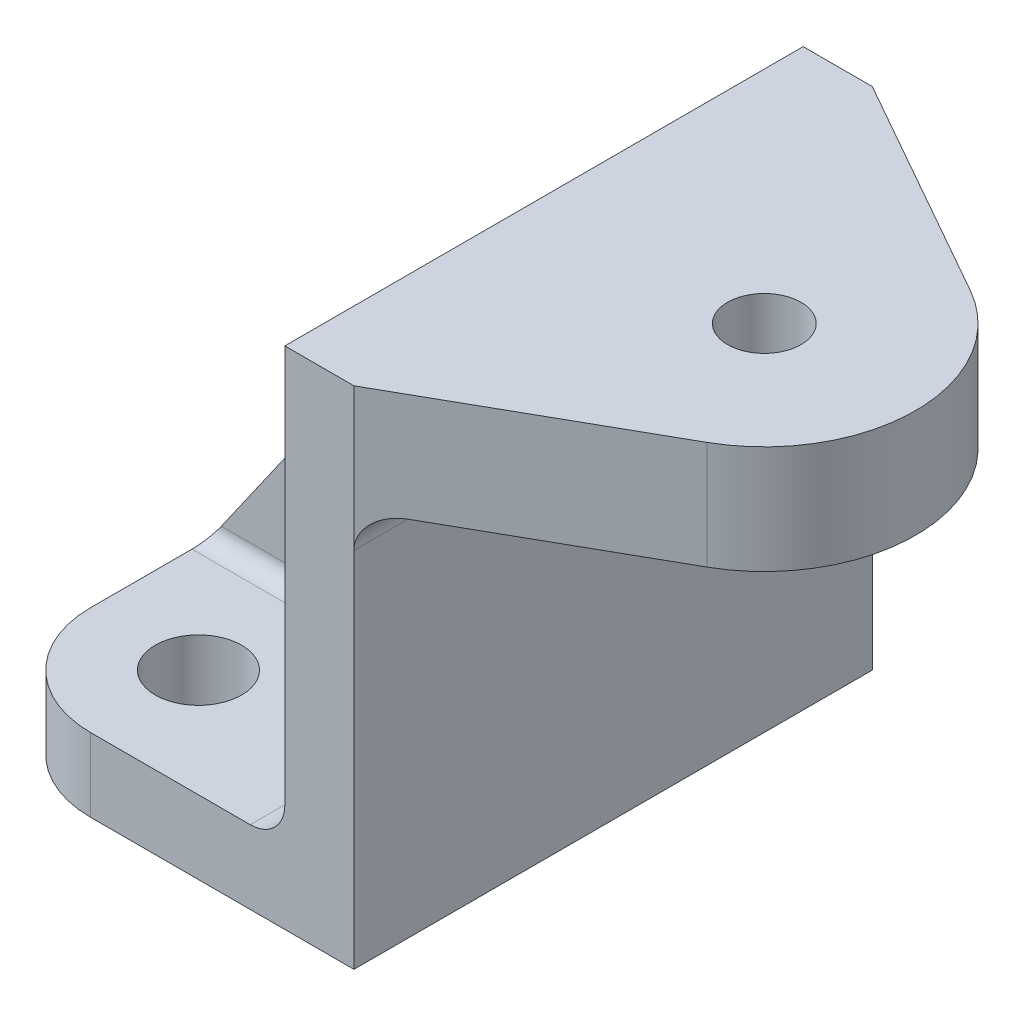
ISO-10303-21;
HEADER;
FILE_DESCRIPTION(('STEP AP214'),'2;1');
FILE_NAME('part.step','',(''),(''),'','','');
FILE_SCHEMA(('AUTOMOTIVE_DESIGN { 1 0 10303 214 1 1 1 1 }'));
ENDSEC;
DATA;
#1=APPLICATION_CONTEXT('core data for automotive mechanical design processes');
#2=APPLICATION_PROTOCOL_DEFINITION('international standard','automotive_design',2000,#1);
#3=PRODUCT_CONTEXT('',#1,'mechanical');
#4=PRODUCT('Part','Part','',(#3));
#5=PRODUCT_RELATED_PRODUCT_CATEGORY('part','',(#4));
#6=PRODUCT_DEFINITION_FORMATION('','',#4);
#7=PRODUCT_DEFINITION_CONTEXT('part definition',#1,'design');
#8=PRODUCT_DEFINITION('design','',#6,#7);
#9=PRODUCT_DEFINITION_SHAPE('','',#8);
#10=(LENGTH_UNIT() NAMED_UNIT(*) SI_UNIT(.MILLI.,.METRE.));
#11=(NAMED_UNIT(*) PLANE_ANGLE_UNIT() SI_UNIT($,.RADIAN.));
#12=(NAMED_UNIT(*) SI_UNIT($,.STERADIAN.) SOLID_ANGLE_UNIT());
#13=UNCERTAINTY_MEASURE_WITH_UNIT(LENGTH_MEASURE(1.E-05),#10,'distance_accuracy_value','');
#14=(GEOMETRIC_REPRESENTATION_CONTEXT(3) GLOBAL_UNCERTAINTY_ASSIGNED_CONTEXT((#13)) GLOBAL_UNIT_ASSIGNED_CONTEXT((#10,
#11,#12)) REPRESENTATION_CONTEXT('',''));
#15=CARTESIAN_POINT('',(0.,0.,0.));
#16=DIRECTION('',(0.,0.,1.));
#17=DIRECTION('',(1.,0.,0.));
#18=AXIS2_PLACEMENT_3D('',#15,#16,#17);
#19=CARTESIAN_POINT('',(-30.5000000000001,17.,35.));
#20=DIRECTION('',(0.,-1.,0.));
#21=DIRECTION('',(0.,0.,-1.));
#22=AXIS2_PLACEMENT_3D('',#19,#20,#21);
#23=PLANE('',#22);
#24=CARTESIAN_POINT('',(-30.5000000000001,17.,-35.));
#25=DIRECTION('',(0.,1.,0.));
#26=DIRECTION('',(0.,0.,1.));
#27=AXIS2_PLACEMENT_3D('',#24,#25,#26);
#28=CIRCLE('',#27,10.);
#29=CARTESIAN_POINT('',(-30.5000000000001,17.,-25.));
#30=VERTEX_POINT('',#29);
#31=EDGE_CURVE('E236',#30,#30,#28,.T.);
#32=ORIENTED_EDGE('',*,*,#31,.F.);
#33=EDGE_LOOP('',(#32));
#34=FACE_BOUND('',#33,.T.);
#35=DIRECTION('',(0.,0.,1.));
#36=VECTOR('',#35,1.);
#37=CARTESIAN_POINT('',(-55.5000000000001,17.,-35.));
#38=LINE('',#37,#36);
#39=CARTESIAN_POINT('',(-55.5000000000001,17.,-35.));
#40=VERTEX_POINT('',#39);
#41=CARTESIAN_POINT('',(-55.5000000000001,17.,-11.5));
#42=VERTEX_POINT('',#41);
#43=EDGE_CURVE('E248',#40,#42,#38,.T.);
#44=ORIENTED_EDGE('',*,*,#43,.T.);
#45=DIRECTION('',(-1.,0.,0.));
#46=VECTOR('',#45,1.);
#47=CARTESIAN_POINT('',(6.49999999999992,17.,-11.5));
#48=LINE('',#47,#46);
#49=CARTESIAN_POINT('',(6.49999999999991,17.,-11.5));
#50=VERTEX_POINT('',#49);
#51=EDGE_CURVE('E303',#42,#50,#48,.F.);
#52=ORIENTED_EDGE('',*,*,#51,.T.);
#53=DIRECTION('',(0.,0.,1.));
#54=VECTOR('',#53,1.);
#55=CARTESIAN_POINT('',(6.49999999999991,17.,-60.));
#56=LINE('',#55,#54);
#57=CARTESIAN_POINT('',(6.49999999999991,17.,-60.));
#58=VERTEX_POINT('',#57);
#59=EDGE_CURVE('E288',#50,#58,#56,.F.);
#60=ORIENTED_EDGE('',*,*,#59,.T.);
#61=DIRECTION('',(-1.,0.,0.));
#62=VECTOR('',#61,1.);
#63=CARTESIAN_POINT('',(-30.4999999999999,17.,-60.));
#64=LINE('',#63,#62);
#65=CARTESIAN_POINT('',(-30.4999999999999,17.,-60.));
#66=VERTEX_POINT('',#65);
#67=EDGE_CURVE('E242',#58,#66,#64,.T.);
#68=ORIENTED_EDGE('',*,*,#67,.T.);
#69=CARTESIAN_POINT('',(-30.5000000000001,17.,-35.));
#70=DIRECTION('',(0.,1.,0.));
#71=DIRECTION('',(0.,0.,1.));
#72=AXIS2_PLACEMENT_3D('',#69,#70,#71);
#73=CIRCLE('',#72,25.);
#74=EDGE_CURVE('E244',#66,#40,#73,.T.);
#75=ORIENTED_EDGE('',*,*,#74,.T.);
#76=EDGE_LOOP('',(#44,#52,#60,#68,#75));
#77=FACE_BOUND('',#76,.T.);
#78=ADVANCED_FACE('F35',(#34,#77),#23,.F.);
#79=CARTESIAN_POINT('',(14.4999999999999,117.,-60.));
#80=DIRECTION('',(1.,0.,0.));
#81=DIRECTION('',(0.,0.,-1.));
#82=AXIS2_PLACEMENT_3D('',#79,#80,#81);
#83=PLANE('',#82);
#84=DIRECTION('',(0.,0.,1.));
#85=VECTOR('',#84,1.);
#86=CARTESIAN_POINT('',(14.4999999999999,25.,60.));
#87=LINE('',#86,#85);
#88=CARTESIAN_POINT('',(14.4999999999999,25.,-60.));
#89=VERTEX_POINT('',#88);
#90=CARTESIAN_POINT('',(14.4999999999999,25.,-11.5));
#91=VERTEX_POINT('',#90);
#92=EDGE_CURVE('E285',#89,#91,#87,.T.);
#93=ORIENTED_EDGE('',*,*,#92,.T.);
#94=DIRECTION('',(0.,-1.,0.));
#95=VECTOR('',#94,1.);
#96=CARTESIAN_POINT('',(14.4999999999999,117.,-11.5));
#97=LINE('',#96,#95);
#98=CARTESIAN_POINT('',(14.4999999999999,117.,-11.5));
#99=VERTEX_POINT('',#98);
#100=EDGE_CURVE('E318',#91,#99,#97,.F.);
#101=ORIENTED_EDGE('',*,*,#100,.T.);
#102=DIRECTION('',(0.,0.,1.));
#103=VECTOR('',#102,1.);
#104=CARTESIAN_POINT('',(14.4999999999999,117.,-60.));
#105=LINE('',#104,#103);
#106=CARTESIAN_POINT('',(14.4999999999999,117.,-60.));
#107=VERTEX_POINT('',#106);
#108=EDGE_CURVE('E218',#107,#99,#105,.T.);
#109=ORIENTED_EDGE('',*,*,#108,.F.);
#110=DIRECTION('',(0.,-1.,0.));
#111=VECTOR('',#110,1.);
#112=CARTESIAN_POINT('',(14.4999999999999,117.,-60.));
#113=LINE('',#112,#111);
#114=EDGE_CURVE('E226',#107,#89,#113,.T.);
#115=ORIENTED_EDGE('',*,*,#114,.T.);
#116=EDGE_LOOP('',(#93,#101,#109,#115));
#117=FACE_BOUND('',#116,.T.);
#118=ADVANCED_FACE('F387',(#117),#83,.F.);
#119=CARTESIAN_POINT('',(6.49999999999991,25.,-60.));
#120=DIRECTION('',(0.,0.,-1.));
#121=DIRECTION('',(-1.,0.,0.));
#122=AXIS2_PLACEMENT_3D('',#119,#120,#121);
#123=CYLINDRICAL_SURFACE('',#122,8.);
#124=ORIENTED_EDGE('',*,*,#59,.F.);
#125=CARTESIAN_POINT('',(6.49999999999991,25.,-11.5));
#126=DIRECTION('',(0.,0.,1.));
#127=DIRECTION('',(1.,0.,0.));
#128=AXIS2_PLACEMENT_3D('',#125,#126,#127);
#129=CIRCLE('',#128,8.);
#130=EDGE_CURVE('E305',#50,#91,#129,.T.);
#131=ORIENTED_EDGE('',*,*,#130,.T.);
#132=ORIENTED_EDGE('',*,*,#92,.F.);
#133=CARTESIAN_POINT('',(6.49999999999991,25.,-60.));
#134=DIRECTION('',(0.,0.,1.));
#135=DIRECTION('',(1.,0.,0.));
#136=AXIS2_PLACEMENT_3D('',#133,#134,#135);
#137=CIRCLE('',#136,8.);
#138=EDGE_CURVE('E294',#58,#89,#137,.T.);
#139=ORIENTED_EDGE('',*,*,#138,.F.);
#140=EDGE_LOOP('',(#124,#131,#132,#139));
#141=FACE_BOUND('',#140,.T.);
#142=ADVANCED_FACE('F383',(#141),#123,.F.);
#143=CARTESIAN_POINT('',(-30.5000000000001,17.,35.));
#144=DIRECTION('',(0.,1.,0.));
#145=DIRECTION('',(0.,0.,1.));
#146=AXIS2_PLACEMENT_3D('',#143,#144,#145);
#147=CIRCLE('',#146,10.);
#148=CARTESIAN_POINT('',(-30.5000000000001,17.,45.));
#149=VERTEX_POINT('',#148);
#150=EDGE_CURVE('E230',#149,#149,#147,.T.);
#151=ORIENTED_EDGE('',*,*,#150,.F.);
#152=EDGE_LOOP('',(#151));
#153=FACE_BOUND('',#152,.T.);
#154=CARTESIAN_POINT('',(6.49999999999992,17.,60.));
#155=VERTEX_POINT('',#154);
#156=CARTESIAN_POINT('',(6.49999999999992,17.,11.5));
#157=VERTEX_POINT('',#156);
#158=EDGE_CURVE('E289',#155,#157,#56,.F.);
#159=ORIENTED_EDGE('',*,*,#158,.T.);
#160=DIRECTION('',(-1.,0.,0.));
#161=VECTOR('',#160,1.);
#162=CARTESIAN_POINT('',(-30.5000000000001,17.,11.5));
#163=LINE('',#162,#161);
#164=CARTESIAN_POINT('',(-55.5000000000001,17.,11.5));
#165=VERTEX_POINT('',#164);
#166=EDGE_CURVE('E307',#157,#165,#163,.T.);
#167=ORIENTED_EDGE('',*,*,#166,.T.);
#168=CARTESIAN_POINT('',(-55.5000000000001,17.,35.));
#169=VERTEX_POINT('',#168);
#170=EDGE_CURVE('E247',#165,#169,#38,.T.);
#171=ORIENTED_EDGE('',*,*,#170,.T.);
#172=CARTESIAN_POINT('',(-30.5000000000001,17.,35.));
#173=DIRECTION('',(0.,1.,0.));
#174=DIRECTION('',(0.,0.,-1.));
#175=AXIS2_PLACEMENT_3D('',#172,#173,#174);
#176=CIRCLE('',#175,25.);
#177=CARTESIAN_POINT('',(-30.4999999999999,17.,60.));
#178=VERTEX_POINT('',#177);
#179=EDGE_CURVE('E251',#169,#178,#176,.T.);
#180=ORIENTED_EDGE('',*,*,#179,.T.);
#181=DIRECTION('',(1.,0.,0.));
#182=VECTOR('',#181,1.);
#183=CARTESIAN_POINT('',(-30.4999999999999,17.,60.));
#184=LINE('',#183,#182);
#185=EDGE_CURVE('E253',#178,#155,#184,.T.);
#186=ORIENTED_EDGE('',*,*,#185,.T.);
#187=EDGE_LOOP('',(#159,#167,#171,#180,#186));
#188=FACE_BOUND('',#187,.T.);
#189=ADVANCED_FACE('F437',(#153,#188),#23,.F.);
#190=CARTESIAN_POINT('',(-30.5000000000001,0.,35.));
#191=DIRECTION('',(0.,-1.,0.));
#192=DIRECTION('',(0.,0.,-1.));
#193=AXIS2_PLACEMENT_3D('',#190,#191,#192);
#194=PLANE('',#193);
#195=CARTESIAN_POINT('',(-30.5000000000001,0.,35.));
#196=DIRECTION('',(0.,1.,0.));
#197=DIRECTION('',(0.,0.,-1.));
#198=AXIS2_PLACEMENT_3D('',#195,#196,#197);
#199=CIRCLE('',#198,25.);
#200=CARTESIAN_POINT('',(-55.5000000000001,0.,35.));
#201=VERTEX_POINT('',#200);
#202=CARTESIAN_POINT('',(-30.4999999999999,0.,60.));
#203=VERTEX_POINT('',#202);
#204=EDGE_CURVE('E265',#201,#203,#199,.T.);
#205=ORIENTED_EDGE('',*,*,#204,.F.);
#206=DIRECTION('',(0.,0.,1.));
#207=VECTOR('',#206,1.);
#208=CARTESIAN_POINT('',(-55.5000000000001,0.,-35.));
#209=LINE('',#208,#207);
#210=CARTESIAN_POINT('',(-55.5000000000001,0.,-35.));
#211=VERTEX_POINT('',#210);
#212=EDGE_CURVE('E263',#211,#201,#209,.T.);
#213=ORIENTED_EDGE('',*,*,#212,.F.);
#214=CARTESIAN_POINT('',(-30.5000000000001,0.,-35.));
#215=DIRECTION('',(0.,1.,0.));
#216=DIRECTION('',(0.,0.,1.));
#217=AXIS2_PLACEMENT_3D('',#214,#215,#216);
#218=CIRCLE('',#217,25.);
#219=CARTESIAN_POINT('',(-30.4999999999999,0.,-60.));
#220=VERTEX_POINT('',#219);
#221=EDGE_CURVE('E261',#220,#211,#218,.T.);
#222=ORIENTED_EDGE('',*,*,#221,.F.);
#223=DIRECTION('',(-1.,0.,0.));
#224=VECTOR('',#223,1.);
#225=CARTESIAN_POINT('',(-30.4999999999999,0.,-60.));
#226=LINE('',#225,#224);
#227=CARTESIAN_POINT('',(30.4999999999999,0.,-60.));
#228=VERTEX_POINT('',#227);
#229=EDGE_CURVE('E259',#228,#220,#226,.T.);
#230=ORIENTED_EDGE('',*,*,#229,.F.);
#231=DIRECTION('',(0.,0.,-1.));
#232=VECTOR('',#231,1.);
#233=CARTESIAN_POINT('',(30.4999999999999,0.,-60.));
#234=LINE('',#233,#232);
#235=CARTESIAN_POINT('',(30.4999999999999,0.,60.));
#236=VERTEX_POINT('',#235);
#237=EDGE_CURVE('E239',#236,#228,#234,.T.);
#238=ORIENTED_EDGE('',*,*,#237,.F.);
#239=DIRECTION('',(1.,0.,0.));
#240=VECTOR('',#239,1.);
#241=CARTESIAN_POINT('',(-30.4999999999999,0.,60.));
#242=LINE('',#241,#240);
#243=EDGE_CURVE('E245',#203,#236,#242,.T.);
#244=ORIENTED_EDGE('',*,*,#243,.F.);
#245=EDGE_LOOP('',(#205,#213,#222,#230,#238,#244));
#246=FACE_BOUND('',#245,.T.);
#247=CARTESIAN_POINT('',(-30.5000000000001,0.,35.));
#248=DIRECTION('',(0.,1.,0.));
#249=DIRECTION('',(0.,0.,1.));
#250=AXIS2_PLACEMENT_3D('',#247,#248,#249);
#251=CIRCLE('',#250,10.);
#252=CARTESIAN_POINT('',(-30.5000000000001,0.,45.));
#253=VERTEX_POINT('',#252);
#254=EDGE_CURVE('E229',#253,#253,#251,.T.);
#255=ORIENTED_EDGE('',*,*,#254,.T.);
#256=EDGE_LOOP('',(#255));
#257=FACE_BOUND('',#256,.T.);
#258=CARTESIAN_POINT('',(-30.5000000000001,0.,-35.));
#259=DIRECTION('',(0.,1.,0.));
#260=DIRECTION('',(0.,0.,1.));
#261=AXIS2_PLACEMENT_3D('',#258,#259,#260);
#262=CIRCLE('',#261,10.);
#263=CARTESIAN_POINT('',(-30.5000000000001,0.,-25.));
#264=VERTEX_POINT('',#263);
#265=EDGE_CURVE('E233',#264,#264,#262,.T.);
#266=ORIENTED_EDGE('',*,*,#265,.T.);
#267=EDGE_LOOP('',(#266));
#268=FACE_BOUND('',#267,.T.);
#269=ADVANCED_FACE('F365',(#246,#257,#268),#194,.T.);
#270=CARTESIAN_POINT('',(30.4999999999999,17.,-60.));
#271=DIRECTION('',(-1.,0.,0.));
#272=DIRECTION('',(0.,0.,1.));
#273=AXIS2_PLACEMENT_3D('',#270,#271,#272);
#274=PLANE('',#273);
#275=DIRECTION('',(0.,-1.,0.));
#276=VECTOR('',#275,1.);
#277=CARTESIAN_POINT('',(30.4999999999999,17.,-60.));
#278=LINE('',#277,#276);
#279=CARTESIAN_POINT('',(30.4999999999999,84.,-60.));
#280=VERTEX_POINT('',#279);
#281=EDGE_CURVE('E282',#280,#228,#278,.T.);
#282=ORIENTED_EDGE('',*,*,#281,.F.);
#283=DIRECTION('',(0.,0.,1.));
#284=VECTOR('',#283,1.);
#285=CARTESIAN_POINT('',(30.4999999999999,84.,60.));
#286=LINE('',#285,#284);
#287=CARTESIAN_POINT('',(30.4999999999999,84.,60.));
#288=VERTEX_POINT('',#287);
#289=EDGE_CURVE('E333',#280,#288,#286,.T.);
#290=ORIENTED_EDGE('',*,*,#289,.T.);
#291=DIRECTION('',(0.,-1.,0.));
#292=VECTOR('',#291,1.);
#293=CARTESIAN_POINT('',(30.4999999999999,17.,60.));
#294=LINE('',#293,#292);
#295=EDGE_CURVE('E256',#288,#236,#294,.T.);
#296=ORIENTED_EDGE('',*,*,#295,.T.);
#297=ORIENTED_EDGE('',*,*,#237,.T.);
#298=EDGE_LOOP('',(#282,#290,#296,#297));
#299=FACE_BOUND('',#298,.T.);
#300=ADVANCED_FACE('F352',(#299),#274,.F.);
#301=CARTESIAN_POINT('',(-30.4999999999999,17.,-60.));
#302=DIRECTION('',(0.,0.,1.));
#303=DIRECTION('',(1.,0.,0.));
#304=AXIS2_PLACEMENT_3D('',#301,#302,#303);
#305=PLANE('',#304);
#306=ORIENTED_EDGE('',*,*,#229,.T.);
#307=DIRECTION('',(0.,-1.,0.));
#308=VECTOR('',#307,1.);
#309=CARTESIAN_POINT('',(-30.4999999999999,17.,-60.));
#310=LINE('',#309,#308);
#311=EDGE_CURVE('E279',#66,#220,#310,.T.);
#312=ORIENTED_EDGE('',*,*,#311,.F.);
#313=ORIENTED_EDGE('',*,*,#67,.F.);
#314=ORIENTED_EDGE('',*,*,#138,.T.);
#315=ORIENTED_EDGE('',*,*,#114,.F.);
#316=DIRECTION('',(-1.,0.,0.));
#317=VECTOR('',#316,1.);
#318=CARTESIAN_POINT('',(30.4999999999999,117.,-60.));
#319=LINE('',#318,#317);
#320=CARTESIAN_POINT('',(30.4999999999999,117.,-60.));
#321=VERTEX_POINT('',#320);
#322=EDGE_CURVE('E214',#321,#107,#319,.T.);
#323=ORIENTED_EDGE('',*,*,#322,.F.);
#324=EDGE_CURVE('E50',#321,#280,#278,.T.);
#325=ORIENTED_EDGE('',*,*,#324,.T.);
#326=ORIENTED_EDGE('',*,*,#281,.T.);
#327=EDGE_LOOP('',(#306,#312,#313,#314,#315,#323,#325,#326));
#328=FACE_BOUND('',#327,.T.);
#329=ADVANCED_FACE('F370',(#328),#305,.F.);
#330=CARTESIAN_POINT('',(-30.5000000000001,17.,-35.));
#331=DIRECTION('',(0.,-1.,0.));
#332=DIRECTION('',(0.,0.,-1.));
#333=AXIS2_PLACEMENT_3D('',#330,#331,#332);
#334=CYLINDRICAL_SURFACE('',#333,25.);
#335=ORIENTED_EDGE('',*,*,#221,.T.);
#336=DIRECTION('',(0.,-1.,0.));
#337=VECTOR('',#336,1.);
#338=CARTESIAN_POINT('',(-55.5000000000001,17.,-35.));
#339=LINE('',#338,#337);
#340=EDGE_CURVE('E276',#40,#211,#339,.T.);
#341=ORIENTED_EDGE('',*,*,#340,.F.);
#342=ORIENTED_EDGE('',*,*,#74,.F.);
#343=ORIENTED_EDGE('',*,*,#311,.T.);
#344=EDGE_LOOP('',(#335,#341,#342,#343));
#345=FACE_BOUND('',#344,.T.);
#346=ADVANCED_FACE('F374',(#345),#334,.T.);
#347=CARTESIAN_POINT('',(-55.5000000000001,17.,-35.));
#348=DIRECTION('',(1.,0.,0.));
#349=DIRECTION('',(0.,0.,-1.));
#350=AXIS2_PLACEMENT_3D('',#347,#348,#349);
#351=PLANE('',#350);
#352=ORIENTED_EDGE('',*,*,#170,.F.);
#353=DIRECTION('',(0.,0.,1.));
#354=VECTOR('',#353,1.);
#355=CARTESIAN_POINT('',(-55.5000000000001,17.,-35.));
#356=LINE('',#355,#354);
#357=EDGE_CURVE('E407',#42,#165,#356,.T.);
#358=ORIENTED_EDGE('',*,*,#357,.F.);
#359=ORIENTED_EDGE('',*,*,#43,.F.);
#360=ORIENTED_EDGE('',*,*,#340,.T.);
#361=ORIENTED_EDGE('',*,*,#212,.T.);
#362=DIRECTION('',(0.,-1.,0.));
#363=VECTOR('',#362,1.);
#364=CARTESIAN_POINT('',(-55.5000000000001,17.,35.));
#365=LINE('',#364,#363);
#366=EDGE_CURVE('E273',#169,#201,#365,.T.);
#367=ORIENTED_EDGE('',*,*,#366,.F.);
#368=EDGE_LOOP('',(#352,#358,#359,#360,#361,#367));
#369=FACE_BOUND('',#368,.T.);
#370=ADVANCED_FACE('F636',(#369),#351,.F.);
#371=CARTESIAN_POINT('',(-30.5000000000001,17.,35.));
#372=DIRECTION('',(0.,-1.,0.));
#373=DIRECTION('',(0.,0.,-1.));
#374=AXIS2_PLACEMENT_3D('',#371,#372,#373);
#375=CYLINDRICAL_SURFACE('',#374,25.);
#376=ORIENTED_EDGE('',*,*,#204,.T.);
#377=DIRECTION('',(0.,-1.,0.));
#378=VECTOR('',#377,1.);
#379=CARTESIAN_POINT('',(-30.4999999999999,17.,60.));
#380=LINE('',#379,#378);
#381=EDGE_CURVE('E270',#178,#203,#380,.T.);
#382=ORIENTED_EDGE('',*,*,#381,.F.);
#383=ORIENTED_EDGE('',*,*,#179,.F.);
#384=ORIENTED_EDGE('',*,*,#366,.T.);
#385=EDGE_LOOP('',(#376,#382,#383,#384));
#386=FACE_BOUND('',#385,.T.);
#387=ADVANCED_FACE('F529',(#386),#375,.T.);
#388=CARTESIAN_POINT('',(-30.4999999999999,17.,60.));
#389=DIRECTION('',(0.,0.,-1.));
#390=DIRECTION('',(-1.,0.,0.));
#391=AXIS2_PLACEMENT_3D('',#388,#389,#390);
#392=PLANE('',#391);
#393=ORIENTED_EDGE('',*,*,#243,.T.);
#394=ORIENTED_EDGE('',*,*,#295,.F.);
#395=CARTESIAN_POINT('',(30.4999999999999,117.,60.));
#396=VERTEX_POINT('',#395);
#397=EDGE_CURVE('E70',#396,#288,#294,.T.);
#398=ORIENTED_EDGE('',*,*,#397,.F.);
#399=DIRECTION('',(1.,0.,0.));
#400=VECTOR('',#399,1.);
#401=CARTESIAN_POINT('',(30.4999999999999,117.,60.));
#402=LINE('',#401,#400);
#403=CARTESIAN_POINT('',(14.4999999999999,117.,60.));
#404=VERTEX_POINT('',#403);
#405=EDGE_CURVE('E220',#404,#396,#402,.T.);
#406=ORIENTED_EDGE('',*,*,#405,.F.);
#407=DIRECTION('',(0.,-1.,0.));
#408=VECTOR('',#407,1.);
#409=CARTESIAN_POINT('',(14.4999999999999,117.,60.));
#410=LINE('',#409,#408);
#411=CARTESIAN_POINT('',(14.4999999999999,25.,60.));
#412=VERTEX_POINT('',#411);
#413=EDGE_CURVE('E223',#404,#412,#410,.T.);
#414=ORIENTED_EDGE('',*,*,#413,.T.);
#415=CARTESIAN_POINT('',(6.49999999999992,25.,60.));
#416=DIRECTION('',(0.,0.,-1.));
#417=DIRECTION('',(-1.,0.,0.));
#418=AXIS2_PLACEMENT_3D('',#415,#416,#417);
#419=CIRCLE('',#418,8.);
#420=EDGE_CURVE('E292',#412,#155,#419,.T.);
#421=ORIENTED_EDGE('',*,*,#420,.T.);
#422=ORIENTED_EDGE('',*,*,#185,.F.);
#423=ORIENTED_EDGE('',*,*,#381,.T.);
#424=EDGE_LOOP('',(#393,#394,#398,#406,#414,#421,#422,#423));
#425=FACE_BOUND('',#424,.T.);
#426=ADVANCED_FACE('F356',(#425),#392,.F.);
#427=CARTESIAN_POINT('',(-30.5000000000001,17.,-35.));
#428=DIRECTION('',(0.,-1.,0.));
#429=DIRECTION('',(0.,0.,-1.));
#430=AXIS2_PLACEMENT_3D('',#427,#428,#429);
#431=CYLINDRICAL_SURFACE('',#430,10.);
#432=ORIENTED_EDGE('',*,*,#31,.T.);
#433=EDGE_LOOP('',(#432));
#434=FACE_BOUND('',#433,.T.);
#435=ORIENTED_EDGE('',*,*,#265,.F.);
#436=EDGE_LOOP('',(#435));
#437=FACE_BOUND('',#436,.T.);
#438=ADVANCED_FACE('F528',(#434,#437),#431,.F.);
#439=CARTESIAN_POINT('',(-30.5000000000001,17.,35.));
#440=DIRECTION('',(0.,-1.,0.));
#441=DIRECTION('',(0.,0.,-1.));
#442=AXIS2_PLACEMENT_3D('',#439,#440,#441);
#443=CYLINDRICAL_SURFACE('',#442,10.);
#444=ORIENTED_EDGE('',*,*,#150,.T.);
#445=EDGE_LOOP('',(#444));
#446=FACE_BOUND('',#445,.T.);
#447=ORIENTED_EDGE('',*,*,#254,.F.);
#448=EDGE_LOOP('',(#447));
#449=FACE_BOUND('',#448,.T.);
#450=ADVANCED_FACE('F652',(#446,#449),#443,.F.);
#451=CARTESIAN_POINT('',(14.4999999999999,117.,11.5));
#452=VERTEX_POINT('',#451);
#453=EDGE_CURVE('E217',#452,#404,#105,.T.);
#454=ORIENTED_EDGE('',*,*,#453,.F.);
#455=DIRECTION('',(0.,-1.,0.));
#456=VECTOR('',#455,1.);
#457=CARTESIAN_POINT('',(14.4999999999999,117.,11.5));
#458=LINE('',#457,#456);
#459=CARTESIAN_POINT('',(14.4999999999999,25.,11.5));
#460=VERTEX_POINT('',#459);
#461=EDGE_CURVE('E321',#452,#460,#458,.T.);
#462=ORIENTED_EDGE('',*,*,#461,.T.);
#463=EDGE_CURVE('E284',#460,#412,#87,.T.);
#464=ORIENTED_EDGE('',*,*,#463,.T.);
#465=ORIENTED_EDGE('',*,*,#413,.F.);
#466=EDGE_LOOP('',(#454,#462,#464,#465));
#467=FACE_BOUND('',#466,.T.);
#468=ADVANCED_FACE('F421',(#467),#83,.F.);
#469=CARTESIAN_POINT('',(0.,117.,0.));
#470=DIRECTION('',(0.,-1.,0.));
#471=DIRECTION('',(0.,0.,-1.));
#472=AXIS2_PLACEMENT_3D('',#469,#470,#471);
#473=PLANE('',#472);
#474=CARTESIAN_POINT('',(65.4999999999999,117.,0.));
#475=DIRECTION('',(0.,1.,0.));
#476=DIRECTION('',(0.,0.,1.));
#477=AXIS2_PLACEMENT_3D('',#474,#475,#476);
#478=CIRCLE('',#477,8.50000000000001);
#479=CARTESIAN_POINT('',(65.4999999999999,117.,8.50000000000001));
#480=VERTEX_POINT('',#479);
#481=EDGE_CURVE('E411',#480,#480,#478,.T.);
#482=ORIENTED_EDGE('',*,*,#481,.F.);
#483=EDGE_LOOP('',(#482));
#484=FACE_BOUND('',#483,.T.);
#485=CARTESIAN_POINT('',(65.4999999999999,117.,0.));
#486=DIRECTION('',(0.,1.,0.));
#487=DIRECTION('',(0.,0.,1.));
#488=AXIS2_PLACEMENT_3D('',#485,#486,#487);
#489=CIRCLE('',#488,35.);
#490=CARTESIAN_POINT('',(82.7279792746113,117.,30.4663212435233));
#491=VERTEX_POINT('',#490);
#492=CARTESIAN_POINT('',(82.7279792746113,117.,-30.4663212435233));
#493=VERTEX_POINT('',#492);
#494=EDGE_CURVE('E198',#491,#493,#489,.T.);
#495=ORIENTED_EDGE('',*,*,#494,.T.);
#496=DIRECTION('',(-0.870466321243523,0.,-0.492227979274611));
#497=VECTOR('',#496,1.);
#498=CARTESIAN_POINT('',(30.4999999999999,117.,-60.));
#499=LINE('',#498,#497);
#500=EDGE_CURVE('E192',#493,#321,#499,.T.);
#501=ORIENTED_EDGE('',*,*,#500,.T.);
#502=ORIENTED_EDGE('',*,*,#322,.T.);
#503=ORIENTED_EDGE('',*,*,#108,.T.);
#504=EDGE_CURVE('E78',#99,#452,#105,.T.);
#505=ORIENTED_EDGE('',*,*,#504,.T.);
#506=ORIENTED_EDGE('',*,*,#453,.T.);
#507=ORIENTED_EDGE('',*,*,#405,.T.);
#508=DIRECTION('',(0.870466321243523,0.,-0.492227979274611));
#509=VECTOR('',#508,1.);
#510=CARTESIAN_POINT('',(30.4999999999999,117.,60.));
#511=LINE('',#510,#509);
#512=EDGE_CURVE('E208',#396,#491,#511,.T.);
#513=ORIENTED_EDGE('',*,*,#512,.T.);
#514=EDGE_LOOP('',(#495,#501,#502,#503,#505,#506,#507,#513));
#515=FACE_BOUND('',#514,.T.);
#516=ADVANCED_FACE('F418',(#484,#515),#473,.F.);
#517=ORIENTED_EDGE('',*,*,#463,.F.);
#518=CARTESIAN_POINT('',(6.49999999999992,25.,11.5));
#519=DIRECTION('',(0.,0.,1.));
#520=DIRECTION('',(1.,0.,0.));
#521=AXIS2_PLACEMENT_3D('',#518,#519,#520);
#522=CIRCLE('',#521,8.);
#523=EDGE_CURVE('E316',#460,#157,#522,.F.);
#524=ORIENTED_EDGE('',*,*,#523,.T.);
#525=ORIENTED_EDGE('',*,*,#158,.F.);
#526=ORIENTED_EDGE('',*,*,#420,.F.);
#527=EDGE_LOOP('',(#517,#524,#525,#526));
#528=FACE_BOUND('',#527,.T.);
#529=ADVANCED_FACE('F420',(#528),#123,.F.);
#530=CARTESIAN_POINT('',(30.4999999999999,92.,-60.));
#531=DIRECTION('',(0.492227979274611,0.,-0.870466321243524));
#532=DIRECTION('',(-0.870466321243524,0.,-0.492227979274611));
#533=AXIS2_PLACEMENT_3D('',#530,#531,#532);
#534=PLANE('',#533);
#535=ORIENTED_EDGE('',*,*,#500,.F.);
#536=DIRECTION('',(0.,1.,0.));
#537=VECTOR('',#536,1.);
#538=CARTESIAN_POINT('',(82.7279792746113,92.,-30.4663212435233));
#539=LINE('',#538,#537);
#540=CARTESIAN_POINT('',(82.7279792746113,92.,-30.4663212435233));
#541=VERTEX_POINT('',#540);
#542=EDGE_CURVE('E200',#541,#493,#539,.T.);
#543=ORIENTED_EDGE('',*,*,#542,.F.);
#544=DIRECTION('',(-0.870466321243523,0.,-0.492227979274611));
#545=VECTOR('',#544,1.);
#546=CARTESIAN_POINT('',(30.4999999999999,92.,-60.));
#547=LINE('',#546,#545);
#548=CARTESIAN_POINT('',(38.4999999999999,92.,-55.4761904761905));
#549=VERTEX_POINT('',#548);
#550=EDGE_CURVE('E201',#541,#549,#547,.T.);
#551=ORIENTED_EDGE('',*,*,#550,.T.);
#552=CARTESIAN_POINT('',(38.4999999999999,84.,-55.4761904761905));
#553=DIRECTION('',(0.492227979274611,0.,-0.870466321243524));
#554=DIRECTION('',(-0.870466321243524,0.,-0.492227979274611));
#555=AXIS2_PLACEMENT_3D('',#552,#553,#554);
#556=ELLIPSE('',#555,9.19047619047619,8.);
#557=EDGE_CURVE('E11',#549,#280,#556,.F.);
#558=ORIENTED_EDGE('',*,*,#557,.T.);
#559=ORIENTED_EDGE('',*,*,#324,.F.);
#560=EDGE_LOOP('',(#535,#543,#551,#558,#559));
#561=FACE_BOUND('',#560,.T.);
#562=ADVANCED_FACE('F425',(#561),#534,.T.);
#563=CARTESIAN_POINT('',(65.4999999999999,92.,0.));
#564=DIRECTION('',(0.,1.,0.));
#565=DIRECTION('',(0.,0.,1.));
#566=AXIS2_PLACEMENT_3D('',#563,#564,#565);
#567=CYLINDRICAL_SURFACE('',#566,35.);
#568=CARTESIAN_POINT('',(65.4999999999999,92.,0.));
#569=DIRECTION('',(0.,1.,0.));
#570=DIRECTION('',(0.,0.,1.));
#571=AXIS2_PLACEMENT_3D('',#568,#569,#570);
#572=CIRCLE('',#571,35.);
#573=CARTESIAN_POINT('',(82.7279792746113,92.,30.4663212435233));
#574=VERTEX_POINT('',#573);
#575=EDGE_CURVE('E191',#574,#541,#572,.T.);
#576=ORIENTED_EDGE('',*,*,#575,.T.);
#577=ORIENTED_EDGE('',*,*,#542,.T.);
#578=ORIENTED_EDGE('',*,*,#494,.F.);
#579=DIRECTION('',(0.,1.,0.));
#580=VECTOR('',#579,1.);
#581=CARTESIAN_POINT('',(82.7279792746113,92.,30.4663212435233));
#582=LINE('',#581,#580);
#583=EDGE_CURVE('E188',#574,#491,#582,.T.);
#584=ORIENTED_EDGE('',*,*,#583,.F.);
#585=EDGE_LOOP('',(#576,#577,#578,#584));
#586=FACE_BOUND('',#585,.T.);
#587=ADVANCED_FACE('F195',(#586),#567,.T.);
#588=CARTESIAN_POINT('',(30.4999999999999,92.,60.));
#589=DIRECTION('',(0.492227979274611,0.,0.870466321243523));
#590=DIRECTION('',(0.870466321243524,0.,-0.492227979274611));
#591=AXIS2_PLACEMENT_3D('',#588,#589,#590);
#592=PLANE('',#591);
#593=ORIENTED_EDGE('',*,*,#512,.F.);
#594=ORIENTED_EDGE('',*,*,#397,.T.);
#595=CARTESIAN_POINT('',(38.4999999999999,84.,55.4761904761905));
#596=DIRECTION('',(0.492227979274611,0.,0.870466321243523));
#597=DIRECTION('',(0.870466321243524,0.,-0.492227979274611));
#598=AXIS2_PLACEMENT_3D('',#595,#596,#597);
#599=ELLIPSE('',#598,9.19047619047619,8.);
#600=CARTESIAN_POINT('',(38.4999999999999,92.,55.4761904761905));
#601=VERTEX_POINT('',#600);
#602=EDGE_CURVE('E43',#288,#601,#599,.F.);
#603=ORIENTED_EDGE('',*,*,#602,.T.);
#604=DIRECTION('',(0.870466321243523,0.,-0.492227979274611));
#605=VECTOR('',#604,1.);
#606=CARTESIAN_POINT('',(30.4999999999999,92.,60.));
#607=LINE('',#606,#605);
#608=EDGE_CURVE('E185',#601,#574,#607,.T.);
#609=ORIENTED_EDGE('',*,*,#608,.T.);
#610=ORIENTED_EDGE('',*,*,#583,.T.);
#611=EDGE_LOOP('',(#593,#594,#603,#609,#610));
#612=FACE_BOUND('',#611,.T.);
#613=ADVANCED_FACE('F187',(#612),#592,.T.);
#614=CARTESIAN_POINT('',(65.4999999999999,92.,0.));
#615=DIRECTION('',(0.,1.,0.));
#616=DIRECTION('',(0.,0.,1.));
#617=AXIS2_PLACEMENT_3D('',#614,#615,#616);
#618=PLANE('',#617);
#619=CARTESIAN_POINT('',(65.4999999999999,92.,0.));
#620=DIRECTION('',(0.,1.,0.));
#621=DIRECTION('',(0.,0.,1.));
#622=AXIS2_PLACEMENT_3D('',#619,#620,#621);
#623=CIRCLE('',#622,8.50000000000001);
#624=CARTESIAN_POINT('',(65.4999999999999,92.,8.50000000000001));
#625=VERTEX_POINT('',#624);
#626=EDGE_CURVE('E210',#625,#625,#623,.T.);
#627=ORIENTED_EDGE('',*,*,#626,.T.);
#628=EDGE_LOOP('',(#627));
#629=FACE_BOUND('',#628,.T.);
#630=ORIENTED_EDGE('',*,*,#608,.F.);
#631=DIRECTION('',(0.,0.,1.));
#632=VECTOR('',#631,1.);
#633=CARTESIAN_POINT('',(38.4999999999999,92.,-60.));
#634=LINE('',#633,#632);
#635=EDGE_CURVE('E59',#601,#549,#634,.F.);
#636=ORIENTED_EDGE('',*,*,#635,.T.);
#637=ORIENTED_EDGE('',*,*,#550,.F.);
#638=ORIENTED_EDGE('',*,*,#575,.F.);
#639=EDGE_LOOP('',(#630,#636,#637,#638));
#640=FACE_BOUND('',#639,.T.);
#641=ADVANCED_FACE('F203',(#629,#640),#618,.F.);
#642=CARTESIAN_POINT('',(65.4999999999999,92.,0.));
#643=DIRECTION('',(0.,1.,0.));
#644=DIRECTION('',(0.,0.,1.));
#645=AXIS2_PLACEMENT_3D('',#642,#643,#644);
#646=CYLINDRICAL_SURFACE('',#645,8.50000000000001);
#647=ORIENTED_EDGE('',*,*,#626,.F.);
#648=EDGE_LOOP('',(#647));
#649=FACE_BOUND('',#648,.T.);
#650=ORIENTED_EDGE('',*,*,#481,.T.);
#651=EDGE_LOOP('',(#650));
#652=FACE_BOUND('',#651,.T.);
#653=ADVANCED_FACE('F416',(#649,#652),#646,.F.);
#654=CARTESIAN_POINT('',(22.4999999999999,58.5,7.5));
#655=DIRECTION('',(0.,0.,1.));
#656=DIRECTION('',(1.,0.,0.));
#657=AXIS2_PLACEMENT_3D('',#654,#655,#656);
#658=PLANE('',#657);
#659=DIRECTION('',(-0.573462344363328,-0.81923192051904,0.));
#660=VECTOR('',#659,1.);
#661=CARTESIAN_POINT('',(14.4999999999999,117.,7.5));
#662=LINE('',#661,#660);
#663=CARTESIAN_POINT('',(10.4999999999999,111.285714285714,7.5));
#664=VERTEX_POINT('',#663);
#665=CARTESIAN_POINT('',(-52.7000000000001,21.,7.5));
#666=VERTEX_POINT('',#665);
#667=EDGE_CURVE('E404',#664,#666,#662,.T.);
#668=ORIENTED_EDGE('',*,*,#667,.T.);
#669=DIRECTION('',(-1.,0.,0.));
#670=VECTOR('',#669,1.);
#671=CARTESIAN_POINT('',(22.4999999999999,21.,7.5));
#672=LINE('',#671,#670);
#673=CARTESIAN_POINT('',(6.49999999999992,21.,7.5));
#674=VERTEX_POINT('',#673);
#675=EDGE_CURVE('E314',#666,#674,#672,.F.);
#676=ORIENTED_EDGE('',*,*,#675,.T.);
#677=CARTESIAN_POINT('',(6.49999999999992,25.,7.5));
#678=DIRECTION('',(0.,0.,1.));
#679=DIRECTION('',(1.,0.,0.));
#680=AXIS2_PLACEMENT_3D('',#677,#678,#679);
#681=CIRCLE('',#680,4.);
#682=CARTESIAN_POINT('',(10.4999999999999,25.,7.5));
#683=VERTEX_POINT('',#682);
#684=EDGE_CURVE('E312',#674,#683,#681,.T.);
#685=ORIENTED_EDGE('',*,*,#684,.T.);
#686=DIRECTION('',(0.,-1.,0.));
#687=VECTOR('',#686,1.);
#688=CARTESIAN_POINT('',(10.4999999999999,58.5,7.5));
#689=LINE('',#688,#687);
#690=EDGE_CURVE('E310',#683,#664,#689,.F.);
#691=ORIENTED_EDGE('',*,*,#690,.T.);
#692=EDGE_LOOP('',(#668,#676,#685,#691));
#693=FACE_BOUND('',#692,.T.);
#694=ADVANCED_FACE('F469',(#693),#658,.T.);
#695=CARTESIAN_POINT('',(22.4999999999999,58.5,-7.5));
#696=DIRECTION('',(0.,0.,1.));
#697=DIRECTION('',(1.,0.,0.));
#698=AXIS2_PLACEMENT_3D('',#695,#696,#697);
#699=PLANE('',#698);
#700=CARTESIAN_POINT('',(6.49999999999991,25.,-7.5));
#701=DIRECTION('',(0.,0.,1.));
#702=DIRECTION('',(1.,0.,0.));
#703=AXIS2_PLACEMENT_3D('',#700,#701,#702);
#704=CIRCLE('',#703,4.);
#705=CARTESIAN_POINT('',(10.4999999999999,25.,-7.5));
#706=VERTEX_POINT('',#705);
#707=CARTESIAN_POINT('',(6.49999999999991,21.,-7.5));
#708=VERTEX_POINT('',#707);
#709=EDGE_CURVE('E298',#706,#708,#704,.F.);
#710=ORIENTED_EDGE('',*,*,#709,.T.);
#711=DIRECTION('',(-1.,0.,0.));
#712=VECTOR('',#711,1.);
#713=CARTESIAN_POINT('',(-55.5000000000001,21.,-7.5));
#714=LINE('',#713,#712);
#715=CARTESIAN_POINT('',(-52.7000000000001,21.,-7.5));
#716=VERTEX_POINT('',#715);
#717=EDGE_CURVE('E300',#708,#716,#714,.T.);
#718=ORIENTED_EDGE('',*,*,#717,.T.);
#719=DIRECTION('',(-0.573462344363328,-0.81923192051904,0.));
#720=VECTOR('',#719,1.);
#721=CARTESIAN_POINT('',(14.4999999999999,117.,-7.5));
#722=LINE('',#721,#720);
#723=CARTESIAN_POINT('',(10.4999999999999,111.285714285714,-7.5));
#724=VERTEX_POINT('',#723);
#725=EDGE_CURVE('E341',#724,#716,#722,.T.);
#726=ORIENTED_EDGE('',*,*,#725,.F.);
#727=DIRECTION('',(0.,-1.,0.));
#728=VECTOR('',#727,1.);
#729=CARTESIAN_POINT('',(10.4999999999999,25.,-7.5));
#730=LINE('',#729,#728);
#731=EDGE_CURVE('E296',#724,#706,#730,.T.);
#732=ORIENTED_EDGE('',*,*,#731,.T.);
#733=EDGE_LOOP('',(#710,#718,#726,#732));
#734=FACE_BOUND('',#733,.T.);
#735=ADVANCED_FACE('F400',(#734),#699,.F.);
#736=CARTESIAN_POINT('',(14.4999999999999,117.,0.));
#737=DIRECTION('',(-0.81923192051904,0.573462344363328,0.));
#738=DIRECTION('',(-0.573462344363328,-0.81923192051904,0.));
#739=AXIS2_PLACEMENT_3D('',#736,#737,#738);
#740=PLANE('',#739);
#741=ORIENTED_EDGE('',*,*,#504,.F.);
#742=CARTESIAN_POINT('',(10.4999999999999,111.285714285714,-11.5));
#743=DIRECTION('',(-0.81923192051904,0.573462344363328,0.));
#744=DIRECTION('',(0.573462344363328,0.81923192051904,0.));
#745=AXIS2_PLACEMENT_3D('',#742,#743,#744);
#746=ELLIPSE('',#745,6.97517463756212,4.);
#747=EDGE_CURVE('E328',#99,#724,#746,.F.);
#748=ORIENTED_EDGE('',*,*,#747,.T.);
#749=ORIENTED_EDGE('',*,*,#725,.T.);
#750=CARTESIAN_POINT('',(-52.7000000000001,21.,-11.5));
#751=DIRECTION('',(-0.81923192051904,0.573462344363328,0.));
#752=DIRECTION('',(0.573462344363328,0.81923192051904,0.));
#753=AXIS2_PLACEMENT_3D('',#750,#751,#752);
#754=ELLIPSE('',#753,4.88262224629348,4.);
#755=EDGE_CURVE('E323',#716,#42,#754,.F.);
#756=ORIENTED_EDGE('',*,*,#755,.T.);
#757=ORIENTED_EDGE('',*,*,#357,.T.);
#758=CARTESIAN_POINT('',(-52.7000000000001,21.,11.5));
#759=DIRECTION('',(-0.81923192051904,0.573462344363328,0.));
#760=DIRECTION('',(-0.573462344363328,-0.81923192051904,0.));
#761=AXIS2_PLACEMENT_3D('',#758,#759,#760);
#762=ELLIPSE('',#761,4.88262224629348,4.);
#763=EDGE_CURVE('E326',#165,#666,#762,.F.);
#764=ORIENTED_EDGE('',*,*,#763,.T.);
#765=ORIENTED_EDGE('',*,*,#667,.F.);
#766=CARTESIAN_POINT('',(10.4999999999999,111.285714285714,11.5));
#767=DIRECTION('',(-0.81923192051904,0.573462344363328,0.));
#768=DIRECTION('',(-0.573462344363328,-0.81923192051904,0.));
#769=AXIS2_PLACEMENT_3D('',#766,#767,#768);
#770=ELLIPSE('',#769,6.97517463756212,4.);
#771=EDGE_CURVE('E330',#664,#452,#770,.F.);
#772=ORIENTED_EDGE('',*,*,#771,.T.);
#773=EDGE_LOOP('',(#741,#748,#749,#756,#757,#764,#765,#772));
#774=FACE_BOUND('',#773,.T.);
#775=ADVANCED_FACE('F466',(#774),#740,.T.);
#776=CARTESIAN_POINT('',(10.4999999999999,58.5,-11.5));
#777=DIRECTION('',(0.,1.,0.));
#778=DIRECTION('',(0.,0.,1.));
#779=AXIS2_PLACEMENT_3D('',#776,#777,#778);
#780=CYLINDRICAL_SURFACE('',#779,4.);
#781=ORIENTED_EDGE('',*,*,#747,.F.);
#782=ORIENTED_EDGE('',*,*,#100,.F.);
#783=CARTESIAN_POINT('',(10.4999999999999,25.,-11.5));
#784=DIRECTION('',(0.,1.,0.));
#785=DIRECTION('',(0.,0.,1.));
#786=AXIS2_PLACEMENT_3D('',#783,#784,#785);
#787=CIRCLE('',#786,4.);
#788=EDGE_CURVE('E337',#706,#91,#787,.T.);
#789=ORIENTED_EDGE('',*,*,#788,.F.);
#790=ORIENTED_EDGE('',*,*,#731,.F.);
#791=EDGE_LOOP('',(#781,#782,#789,#790));
#792=FACE_BOUND('',#791,.T.);
#793=ADVANCED_FACE('F392',(#792),#780,.F.);
#794=CARTESIAN_POINT('',(6.49999999999991,25.,-11.5));
#795=DIRECTION('',(0.,0.,1.));
#796=DIRECTION('',(1.,0.,0.));
#797=AXIS2_PLACEMENT_3D('',#794,#795,#796);
#798=DEGENERATE_TOROIDAL_SURFACE('',#797,4.,4.,.T.);
#799=ORIENTED_EDGE('',*,*,#788,.T.);
#800=ORIENTED_EDGE('',*,*,#130,.F.);
#801=CARTESIAN_POINT('',(6.49999999999991,21.,-11.5));
#802=DIRECTION('',(1.,0.,0.));
#803=DIRECTION('',(0.,0.,-1.));
#804=AXIS2_PLACEMENT_3D('',#801,#802,#803);
#805=CIRCLE('',#804,4.);
#806=EDGE_CURVE('E334',#708,#50,#805,.T.);
#807=ORIENTED_EDGE('',*,*,#806,.F.);
#808=ORIENTED_EDGE('',*,*,#709,.F.);
#809=EDGE_LOOP('',(#799,#800,#807,#808));
#810=FACE_BOUND('',#809,.T.);
#811=ADVANCED_FACE('F396',(#810),#798,.F.);
#812=CARTESIAN_POINT('',(22.4999999999999,21.,-11.5));
#813=DIRECTION('',(1.,0.,0.));
#814=DIRECTION('',(0.,0.,-1.));
#815=AXIS2_PLACEMENT_3D('',#812,#813,#814);
#816=CYLINDRICAL_SURFACE('',#815,4.);
#817=ORIENTED_EDGE('',*,*,#806,.T.);
#818=ORIENTED_EDGE('',*,*,#51,.F.);
#819=ORIENTED_EDGE('',*,*,#755,.F.);
#820=ORIENTED_EDGE('',*,*,#717,.F.);
#821=EDGE_LOOP('',(#817,#818,#819,#820));
#822=FACE_BOUND('',#821,.T.);
#823=ADVANCED_FACE('F487',(#822),#816,.F.);
#824=CARTESIAN_POINT('',(10.4999999999999,117.,11.5));
#825=DIRECTION('',(0.,-1.,0.));
#826=DIRECTION('',(0.,0.,-1.));
#827=AXIS2_PLACEMENT_3D('',#824,#825,#826);
#828=CYLINDRICAL_SURFACE('',#827,4.);
#829=ORIENTED_EDGE('',*,*,#771,.F.);
#830=ORIENTED_EDGE('',*,*,#690,.F.);
#831=CARTESIAN_POINT('',(10.4999999999999,25.,11.5));
#832=DIRECTION('',(0.,1.,0.));
#833=DIRECTION('',(0.,0.,1.));
#834=AXIS2_PLACEMENT_3D('',#831,#832,#833);
#835=CIRCLE('',#834,4.);
#836=EDGE_CURVE('E338',#460,#683,#835,.T.);
#837=ORIENTED_EDGE('',*,*,#836,.F.);
#838=ORIENTED_EDGE('',*,*,#461,.F.);
#839=EDGE_LOOP('',(#829,#830,#837,#838));
#840=FACE_BOUND('',#839,.T.);
#841=ADVANCED_FACE('F473',(#840),#828,.F.);
#842=CARTESIAN_POINT('',(6.49999999999992,25.,11.5));
#843=DIRECTION('',(0.,0.,1.));
#844=DIRECTION('',(1.,0.,0.));
#845=AXIS2_PLACEMENT_3D('',#842,#843,#844);
#846=DEGENERATE_TOROIDAL_SURFACE('',#845,4.,4.,.T.);
#847=ORIENTED_EDGE('',*,*,#836,.T.);
#848=ORIENTED_EDGE('',*,*,#684,.F.);
#849=CARTESIAN_POINT('',(6.49999999999992,21.,11.5));
#850=DIRECTION('',(1.,0.,0.));
#851=DIRECTION('',(0.,0.,-1.));
#852=AXIS2_PLACEMENT_3D('',#849,#850,#851);
#853=CIRCLE('',#852,4.);
#854=EDGE_CURVE('E342',#157,#674,#853,.T.);
#855=ORIENTED_EDGE('',*,*,#854,.F.);
#856=ORIENTED_EDGE('',*,*,#523,.F.);
#857=EDGE_LOOP('',(#847,#848,#855,#856));
#858=FACE_BOUND('',#857,.T.);
#859=ADVANCED_FACE('F431',(#858),#846,.F.);
#860=CARTESIAN_POINT('',(-30.5000000000001,21.,11.5));
#861=DIRECTION('',(-1.,0.,0.));
#862=DIRECTION('',(0.,0.,1.));
#863=AXIS2_PLACEMENT_3D('',#860,#861,#862);
#864=CYLINDRICAL_SURFACE('',#863,4.);
#865=ORIENTED_EDGE('',*,*,#854,.T.);
#866=ORIENTED_EDGE('',*,*,#675,.F.);
#867=ORIENTED_EDGE('',*,*,#763,.F.);
#868=ORIENTED_EDGE('',*,*,#166,.F.);
#869=EDGE_LOOP('',(#865,#866,#867,#868));
#870=FACE_BOUND('',#869,.T.);
#871=ADVANCED_FACE('F427',(#870),#864,.F.);
#872=CARTESIAN_POINT('',(38.4999999999999,84.,-60.));
#873=DIRECTION('',(0.,0.,-1.));
#874=DIRECTION('',(-1.,0.,0.));
#875=AXIS2_PLACEMENT_3D('',#872,#873,#874);
#876=CYLINDRICAL_SURFACE('',#875,8.);
#877=ORIENTED_EDGE('',*,*,#557,.F.);
#878=ORIENTED_EDGE('',*,*,#635,.F.);
#879=ORIENTED_EDGE('',*,*,#602,.F.);
#880=ORIENTED_EDGE('',*,*,#289,.F.);
#881=EDGE_LOOP('',(#877,#878,#879,#880));
#882=FACE_BOUND('',#881,.T.);
#883=ADVANCED_FACE('F37',(#882),#876,.F.);
#884=CLOSED_SHELL('',(#78,#118,#142,#189,#269,#300,#329,#346,#370,#387,#426,#438,#450,#468,#516,
#529,#562,#587,#613,#641,#653,#694,#735,#775,#793,#811,#823,#841,#859,#871,#883));
#885=MANIFOLD_SOLID_BREP('B2',#884);
#886=ADVANCED_BREP_SHAPE_REPRESENTATION('',(#18,#885),#14);
#887=SHAPE_DEFINITION_REPRESENTATION(#9,#886);
ENDSEC;
END-ISO-10303-21;
